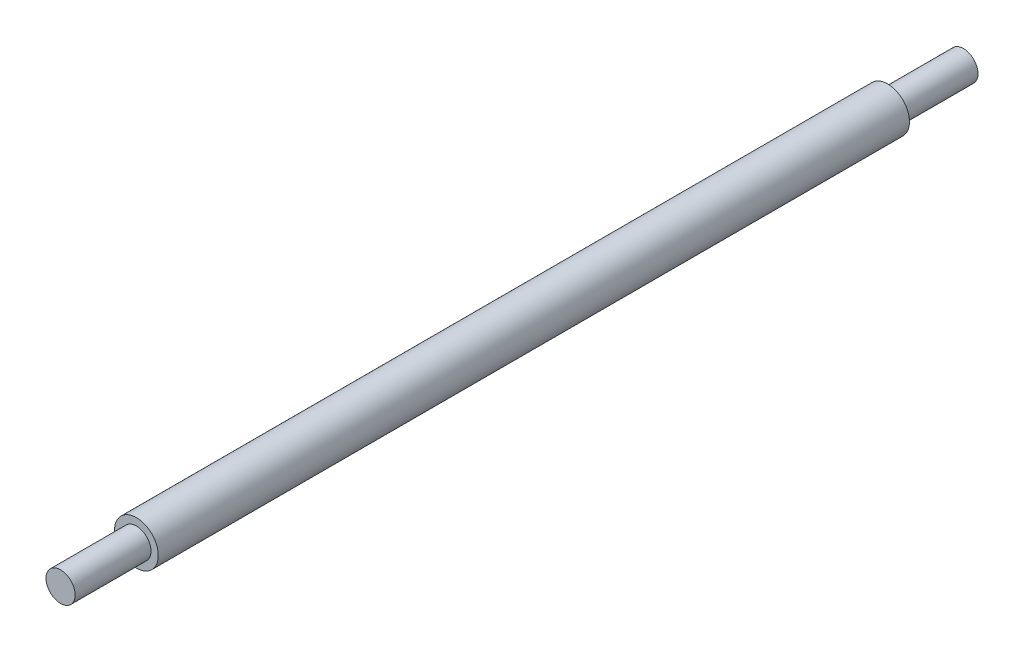
ISO-10303-21;
HEADER;
FILE_DESCRIPTION(('STEP AP214'),'2;1');
FILE_NAME('part.step','',(''),(''),'','','');
FILE_SCHEMA(('AUTOMOTIVE_DESIGN { 1 0 10303 214 1 1 1 1 }'));
ENDSEC;
DATA;
#1=APPLICATION_CONTEXT('core data for automotive mechanical design processes');
#2=APPLICATION_PROTOCOL_DEFINITION('international standard','automotive_design',2000,#1);
#3=PRODUCT_CONTEXT('',#1,'mechanical');
#4=PRODUCT('Part','Part','',(#3));
#5=PRODUCT_RELATED_PRODUCT_CATEGORY('part','',(#4));
#6=PRODUCT_DEFINITION_FORMATION('','',#4);
#7=PRODUCT_DEFINITION_CONTEXT('part definition',#1,'design');
#8=PRODUCT_DEFINITION('design','',#6,#7);
#9=PRODUCT_DEFINITION_SHAPE('','',#8);
#10=(LENGTH_UNIT() NAMED_UNIT(*) SI_UNIT(.MILLI.,.METRE.));
#11=(NAMED_UNIT(*) PLANE_ANGLE_UNIT() SI_UNIT($,.RADIAN.));
#12=(NAMED_UNIT(*) SI_UNIT($,.STERADIAN.) SOLID_ANGLE_UNIT());
#13=UNCERTAINTY_MEASURE_WITH_UNIT(LENGTH_MEASURE(1.E-05),#10,'distance_accuracy_value','');
#14=(GEOMETRIC_REPRESENTATION_CONTEXT(3) GLOBAL_UNCERTAINTY_ASSIGNED_CONTEXT((#13)) GLOBAL_UNIT_ASSIGNED_CONTEXT((#10,
#11,#12)) REPRESENTATION_CONTEXT('',''));
#15=CARTESIAN_POINT('',(0.,0.,0.));
#16=DIRECTION('',(0.,0.,1.));
#17=DIRECTION('',(1.,0.,0.));
#18=AXIS2_PLACEMENT_3D('',#15,#16,#17);
#19=CARTESIAN_POINT('',(0.,0.,327.025));
#20=DIRECTION('',(0.,0.,-1.));
#21=DIRECTION('',(-1.,0.,0.));
#22=AXIS2_PLACEMENT_3D('',#19,#20,#21);
#23=CYLINDRICAL_SURFACE('',#22,9.525);
#24=CARTESIAN_POINT('',(0.,0.,327.025));
#25=DIRECTION('',(0.,0.,1.));
#26=DIRECTION('',(1.,0.,0.));
#27=AXIS2_PLACEMENT_3D('',#24,#25,#26);
#28=CIRCLE('',#27,9.525);
#29=CARTESIAN_POINT('',(-9.525,0.,327.025));
#30=VERTEX_POINT('',#29);
#31=EDGE_CURVE('E45',#30,#30,#28,.T.);
#32=CARTESIAN_POINT('',(0.,0.,0.));
#33=DIRECTION('',(0.,0.,1.));
#34=DIRECTION('',(1.,0.,0.));
#35=AXIS2_PLACEMENT_3D('',#32,#33,#34);
#36=CIRCLE('',#35,9.525);
#37=CARTESIAN_POINT('',(-9.525,0.,0.));
#38=VERTEX_POINT('',#37);
#39=EDGE_CURVE('E36',#38,#38,#36,.T.);
#40=CARTESIAN_POINT('',(-9.525,0.,327.025));
#41=CARTESIAN_POINT('',(-9.525,0.,323.618489583333));
#42=CARTESIAN_POINT('',(-9.525,0.,320.211979166667));
#43=CARTESIAN_POINT('',(-9.525,0.,313.398958333333));
#44=CARTESIAN_POINT('',(-9.525,0.,309.992447916667));
#45=CARTESIAN_POINT('',(-9.525,0.,303.179427083333));
#46=CARTESIAN_POINT('',(-9.525,0.,299.772916666667));
#47=CARTESIAN_POINT('',(-9.525,0.,292.959895833333));
#48=CARTESIAN_POINT('',(-9.525,0.,289.553385416667));
#49=CARTESIAN_POINT('',(-9.525,0.,282.740364583333));
#50=CARTESIAN_POINT('',(-9.525,0.,279.333854166667));
#51=CARTESIAN_POINT('',(-9.525,0.,272.520833333333));
#52=CARTESIAN_POINT('',(-9.525,0.,269.114322916667));
#53=CARTESIAN_POINT('',(-9.525,0.,262.301302083333));
#54=CARTESIAN_POINT('',(-9.525,0.,258.894791666667));
#55=CARTESIAN_POINT('',(-9.525,0.,252.081770833333));
#56=CARTESIAN_POINT('',(-9.525,0.,248.675260416667));
#57=CARTESIAN_POINT('',(-9.525,0.,241.862239583333));
#58=CARTESIAN_POINT('',(-9.525,0.,238.455729166667));
#59=CARTESIAN_POINT('',(-9.525,0.,231.642708333333));
#60=CARTESIAN_POINT('',(-9.525,0.,228.236197916667));
#61=CARTESIAN_POINT('',(-9.525,0.,221.423177083333));
#62=CARTESIAN_POINT('',(-9.525,0.,218.016666666667));
#63=CARTESIAN_POINT('',(-9.525,0.,211.203645833333));
#64=CARTESIAN_POINT('',(-9.525,0.,207.797135416667));
#65=CARTESIAN_POINT('',(-9.525,0.,200.984114583333));
#66=CARTESIAN_POINT('',(-9.525,0.,197.577604166667));
#67=CARTESIAN_POINT('',(-9.525,0.,190.764583333333));
#68=CARTESIAN_POINT('',(-9.525,0.,187.358072916667));
#69=CARTESIAN_POINT('',(-9.525,0.,180.545052083333));
#70=CARTESIAN_POINT('',(-9.525,0.,177.138541666667));
#71=CARTESIAN_POINT('',(-9.525,0.,170.325520833333));
#72=CARTESIAN_POINT('',(-9.525,0.,166.919010416667));
#73=CARTESIAN_POINT('',(-9.525,0.,160.105989583333));
#74=CARTESIAN_POINT('',(-9.525,0.,156.699479166667));
#75=CARTESIAN_POINT('',(-9.525,0.,149.886458333333));
#76=CARTESIAN_POINT('',(-9.525,0.,146.479947916667));
#77=CARTESIAN_POINT('',(-9.525,0.,139.666927083333));
#78=CARTESIAN_POINT('',(-9.525,0.,136.260416666667));
#79=CARTESIAN_POINT('',(-9.525,0.,129.447395833333));
#80=CARTESIAN_POINT('',(-9.525,0.,126.040885416667));
#81=CARTESIAN_POINT('',(-9.525,0.,119.227864583333));
#82=CARTESIAN_POINT('',(-9.525,0.,115.821354166667));
#83=CARTESIAN_POINT('',(-9.525,0.,109.008333333333));
#84=CARTESIAN_POINT('',(-9.525,0.,105.601822916667));
#85=CARTESIAN_POINT('',(-9.525,0.,98.7888020833333));
#86=CARTESIAN_POINT('',(-9.525,0.,95.3822916666666));
#87=CARTESIAN_POINT('',(-9.525,0.,88.5692708333332));
#88=CARTESIAN_POINT('',(-9.525,0.,85.1627604166666));
#89=CARTESIAN_POINT('',(-9.525,0.,78.3497395833333));
#90=CARTESIAN_POINT('',(-9.525,0.,74.9432291666666));
#91=CARTESIAN_POINT('',(-9.525,0.,68.1302083333333));
#92=CARTESIAN_POINT('',(-9.525,0.,64.7236979166666));
#93=CARTESIAN_POINT('',(-9.525,0.,57.9106770833333));
#94=CARTESIAN_POINT('',(-9.525,0.,54.5041666666666));
#95=CARTESIAN_POINT('',(-9.525,0.,47.6911458333333));
#96=CARTESIAN_POINT('',(-9.525,0.,44.2846354166666));
#97=CARTESIAN_POINT('',(-9.525,0.,37.4716145833333));
#98=CARTESIAN_POINT('',(-9.525,0.,34.0651041666666));
#99=CARTESIAN_POINT('',(-9.525,0.,27.2520833333333));
#100=CARTESIAN_POINT('',(-9.525,0.,23.8455729166666));
#101=CARTESIAN_POINT('',(-9.525,0.,17.0325520833333));
#102=CARTESIAN_POINT('',(-9.525,0.,13.6260416666666));
#103=CARTESIAN_POINT('',(-9.525,0.,6.8130208333333));
#104=CARTESIAN_POINT('',(-9.525,0.,3.40651041666663));
#105=CARTESIAN_POINT('',(-9.525,0.,0.));
#106=B_SPLINE_CURVE_WITH_KNOTS('',3,(#40,#41,#42,#43,#44,#45,#46,#47,#48,#49,#50,#51,#52,#53,
#54,#55,#56,#57,#58,#59,#60,#61,#62,#63,#64,#65,#66,#67,#68,#69,#70,#71,#72,#73,#74,#75,#76,#77,
#78,#79,#80,#81,#82,#83,#84,#85,#86,#87,#88,#89,#90,#91,#92,#93,#94,#95,#96,#97,#98,#99,#100,
#101,#102,#103,#104,#105),.UNSPECIFIED.,.F.,.F.,(4,2,2,2,2,2,2,2,2,2,2,2,2,2,2,2,2,2,2,2,2,2,2,
2,2,2,2,2,2,2,2,2,4),(0.,10.21953125,20.4390625,30.65859375,40.878125,51.0976562500001,
61.3171875,71.5367187500001,81.75625,91.9757812500001,102.1953125,112.41484375,122.634375,
132.85390625,143.0734375,153.29296875,163.5125,173.73203125,183.9515625,194.17109375,204.390625,
214.61015625,224.8296875,235.04921875,245.26875,255.48828125,265.7078125,275.92734375,
286.146875,296.36640625,306.5859375,316.80546875,327.025),.UNSPECIFIED.);
#107=EDGE_CURVE('BSEAM33',#30,#38,#106,.T.);
#108=ORIENTED_EDGE('',*,*,#31,.F.);
#109=ORIENTED_EDGE('',*,*,#39,.T.);
#110=ORIENTED_EDGE('',*,*,#107,.T.);
#111=ORIENTED_EDGE('',*,*,#107,.F.);
#112=EDGE_LOOP('',(#108,#110,#109,#111));
#113=FACE_BOUND('',#112,.T.);
#114=ADVANCED_FACE('F33',(#113),#23,.T.);
#115=CARTESIAN_POINT('',(0.,0.,327.025));
#116=DIRECTION('',(0.,0.,1.));
#117=DIRECTION('',(1.,0.,0.));
#118=AXIS2_PLACEMENT_3D('',#115,#116,#117);
#119=PLANE('',#118);
#120=CARTESIAN_POINT('',(0.,0.,327.025));
#121=DIRECTION('',(0.,0.,1.));
#122=DIRECTION('',(1.,0.,0.));
#123=AXIS2_PLACEMENT_3D('',#120,#121,#122);
#124=CIRCLE('',#123,6.35);
#125=CARTESIAN_POINT('',(6.35,0.,327.025));
#126=VERTEX_POINT('',#125);
#127=EDGE_CURVE('E40',#126,#126,#124,.T.);
#128=ORIENTED_EDGE('',*,*,#127,.F.);
#129=EDGE_LOOP('',(#128));
#130=FACE_BOUND('',#129,.T.);
#131=ORIENTED_EDGE('',*,*,#31,.T.);
#132=EDGE_LOOP('',(#131));
#133=FACE_BOUND('',#132,.T.);
#134=ADVANCED_FACE('F62',(#130,#133),#119,.T.);
#135=CARTESIAN_POINT('',(0.,0.,0.));
#136=DIRECTION('',(0.,0.,1.));
#137=DIRECTION('',(1.,0.,0.));
#138=AXIS2_PLACEMENT_3D('',#135,#136,#137);
#139=PLANE('',#138);
#140=CARTESIAN_POINT('',(0.,0.,0.));
#141=DIRECTION('',(0.,0.,-1.));
#142=DIRECTION('',(-1.,0.,0.));
#143=AXIS2_PLACEMENT_3D('',#140,#141,#142);
#144=CIRCLE('',#143,6.35);
#145=CARTESIAN_POINT('',(-6.35,0.,0.));
#146=VERTEX_POINT('',#145);
#147=EDGE_CURVE('E10',#146,#146,#144,.T.);
#148=ORIENTED_EDGE('',*,*,#147,.F.);
#149=EDGE_LOOP('',(#148));
#150=FACE_BOUND('',#149,.T.);
#151=ORIENTED_EDGE('',*,*,#39,.F.);
#152=EDGE_LOOP('',(#151));
#153=FACE_BOUND('',#152,.T.);
#154=ADVANCED_FACE('F59',(#150,#153),#139,.F.);
#155=CARTESIAN_POINT('',(0.,0.,360.045));
#156=DIRECTION('',(0.,0.,-1.));
#157=DIRECTION('',(-1.,0.,0.));
#158=AXIS2_PLACEMENT_3D('',#155,#156,#157);
#159=CYLINDRICAL_SURFACE('',#158,6.35);
#160=CARTESIAN_POINT('',(0.,0.,360.045));
#161=DIRECTION('',(0.,0.,1.));
#162=DIRECTION('',(1.,0.,0.));
#163=AXIS2_PLACEMENT_3D('',#160,#161,#162);
#164=CIRCLE('',#163,6.35);
#165=CARTESIAN_POINT('',(6.35,0.,360.045));
#166=VERTEX_POINT('',#165);
#167=EDGE_CURVE('E50',#166,#166,#164,.T.);
#168=ORIENTED_EDGE('',*,*,#167,.F.);
#169=EDGE_LOOP('',(#168));
#170=FACE_BOUND('',#169,.T.);
#171=ORIENTED_EDGE('',*,*,#127,.T.);
#172=EDGE_LOOP('',(#171));
#173=FACE_BOUND('',#172,.T.);
#174=ADVANCED_FACE('F61',(#170,#173),#159,.T.);
#175=CARTESIAN_POINT('',(0.,0.,360.045));
#176=DIRECTION('',(0.,0.,1.));
#177=DIRECTION('',(1.,0.,0.));
#178=AXIS2_PLACEMENT_3D('',#175,#176,#177);
#179=PLANE('',#178);
#180=ORIENTED_EDGE('',*,*,#167,.T.);
#181=EDGE_LOOP('',(#180));
#182=FACE_BOUND('',#181,.T.);
#183=ADVANCED_FACE('F68',(#182),#179,.T.);
#184=CARTESIAN_POINT('',(0.,0.,-33.02));
#185=DIRECTION('',(0.,0.,1.));
#186=DIRECTION('',(1.,0.,0.));
#187=AXIS2_PLACEMENT_3D('',#184,#185,#186);
#188=CYLINDRICAL_SURFACE('',#187,6.35);
#189=CARTESIAN_POINT('',(0.,0.,-33.02));
#190=DIRECTION('',(0.,0.,-1.));
#191=DIRECTION('',(-1.,0.,0.));
#192=AXIS2_PLACEMENT_3D('',#189,#190,#191);
#193=CIRCLE('',#192,6.35);
#194=CARTESIAN_POINT('',(-6.35,0.,-33.02));
#195=VERTEX_POINT('',#194);
#196=EDGE_CURVE('E49',#195,#195,#193,.T.);
#197=ORIENTED_EDGE('',*,*,#196,.F.);
#198=EDGE_LOOP('',(#197));
#199=FACE_BOUND('',#198,.T.);
#200=ORIENTED_EDGE('',*,*,#147,.T.);
#201=EDGE_LOOP('',(#200));
#202=FACE_BOUND('',#201,.T.);
#203=ADVANCED_FACE('F96',(#199,#202),#188,.T.);
#204=CARTESIAN_POINT('',(0.,0.,-33.02));
#205=DIRECTION('',(0.,0.,-1.));
#206=DIRECTION('',(-1.,0.,0.));
#207=AXIS2_PLACEMENT_3D('',#204,#205,#206);
#208=PLANE('',#207);
#209=ORIENTED_EDGE('',*,*,#196,.T.);
#210=EDGE_LOOP('',(#209));
#211=FACE_BOUND('',#210,.T.);
#212=ADVANCED_FACE('F110',(#211),#208,.T.);
#213=CLOSED_SHELL('',(#114,#134,#154,#174,#183,#203,#212));
#214=MANIFOLD_SOLID_BREP('B2',#213);
#215=ADVANCED_BREP_SHAPE_REPRESENTATION('',(#18,#214),#14);
#216=SHAPE_DEFINITION_REPRESENTATION(#9,#215);
ENDSEC;
END-ISO-10303-21;
